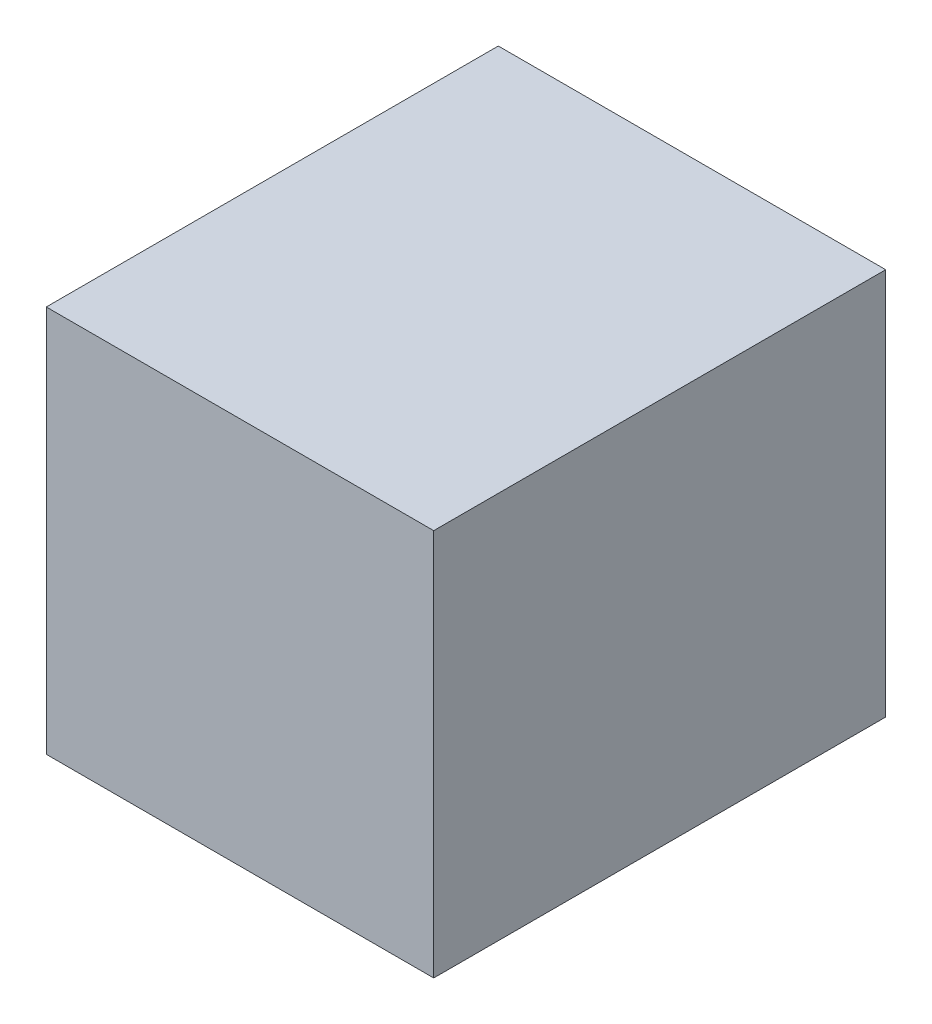
ISO-10303-21;
HEADER;
FILE_DESCRIPTION(('STEP AP214'),'2;1');
FILE_NAME('part.step','',(''),(''),'','','');
FILE_SCHEMA(('AUTOMOTIVE_DESIGN { 1 0 10303 214 1 1 1 1 }'));
ENDSEC;
DATA;
#1=APPLICATION_CONTEXT('core data for automotive mechanical design processes');
#2=APPLICATION_PROTOCOL_DEFINITION('international standard','automotive_design',2000,#1);
#3=PRODUCT_CONTEXT('',#1,'mechanical');
#4=PRODUCT('Part','Part','',(#3));
#5=PRODUCT_RELATED_PRODUCT_CATEGORY('part','',(#4));
#6=PRODUCT_DEFINITION_FORMATION('','',#4);
#7=PRODUCT_DEFINITION_CONTEXT('part definition',#1,'design');
#8=PRODUCT_DEFINITION('design','',#6,#7);
#9=PRODUCT_DEFINITION_SHAPE('','',#8);
#10=(LENGTH_UNIT() NAMED_UNIT(*) SI_UNIT(.MILLI.,.METRE.));
#11=(NAMED_UNIT(*) PLANE_ANGLE_UNIT() SI_UNIT($,.RADIAN.));
#12=(NAMED_UNIT(*) SI_UNIT($,.STERADIAN.) SOLID_ANGLE_UNIT());
#13=UNCERTAINTY_MEASURE_WITH_UNIT(LENGTH_MEASURE(1.E-05),#10,'distance_accuracy_value','');
#14=(GEOMETRIC_REPRESENTATION_CONTEXT(3) GLOBAL_UNCERTAINTY_ASSIGNED_CONTEXT((#13)) GLOBAL_UNIT_ASSIGNED_CONTEXT((#10,
#11,#12)) REPRESENTATION_CONTEXT('',''));
#15=CARTESIAN_POINT('',(0.,0.,0.));
#16=DIRECTION('',(0.,0.,1.));
#17=DIRECTION('',(1.,0.,0.));
#18=AXIS2_PLACEMENT_3D('',#15,#16,#17);
#19=CARTESIAN_POINT('',(30.,-30.,70.));
#20=DIRECTION('',(-1.,0.,0.));
#21=DIRECTION('',(0.,0.,1.));
#22=AXIS2_PLACEMENT_3D('',#19,#20,#21);
#23=PLANE('',#22);
#24=DIRECTION('',(0.,1.,0.));
#25=VECTOR('',#24,1.);
#26=CARTESIAN_POINT('',(30.,-30.,0.));
#27=LINE('',#26,#25);
#28=CARTESIAN_POINT('',(30.,-30.,0.));
#29=VERTEX_POINT('',#28);
#30=CARTESIAN_POINT('',(30.,30.,0.));
#31=VERTEX_POINT('',#30);
#32=EDGE_CURVE('E107',#29,#31,#27,.T.);
#33=ORIENTED_EDGE('',*,*,#32,.T.);
#34=DIRECTION('',(0.,0.,-1.));
#35=VECTOR('',#34,1.);
#36=CARTESIAN_POINT('',(30.,30.,70.));
#37=LINE('',#36,#35);
#38=CARTESIAN_POINT('',(30.,30.,70.));
#39=VERTEX_POINT('',#38);
#40=EDGE_CURVE('E11',#39,#31,#37,.T.);
#41=ORIENTED_EDGE('',*,*,#40,.F.);
#42=DIRECTION('',(0.,1.,0.));
#43=VECTOR('',#42,1.);
#44=CARTESIAN_POINT('',(30.,-30.,70.));
#45=LINE('',#44,#43);
#46=CARTESIAN_POINT('',(30.,-30.,70.));
#47=VERTEX_POINT('',#46);
#48=EDGE_CURVE('E91',#47,#39,#45,.T.);
#49=ORIENTED_EDGE('',*,*,#48,.F.);
#50=DIRECTION('',(0.,0.,-1.));
#51=VECTOR('',#50,1.);
#52=CARTESIAN_POINT('',(30.,-30.,70.));
#53=LINE('',#52,#51);
#54=EDGE_CURVE('E103',#47,#29,#53,.T.);
#55=ORIENTED_EDGE('',*,*,#54,.T.);
#56=EDGE_LOOP('',(#33,#41,#49,#55));
#57=FACE_BOUND('',#56,.T.);
#58=ADVANCED_FACE('F39',(#57),#23,.F.);
#59=CARTESIAN_POINT('',(-30.,30.,70.));
#60=DIRECTION('',(0.,-1.,0.));
#61=DIRECTION('',(0.,0.,-1.));
#62=AXIS2_PLACEMENT_3D('',#59,#60,#61);
#63=PLANE('',#62);
#64=DIRECTION('',(-1.,0.,0.));
#65=VECTOR('',#64,1.);
#66=CARTESIAN_POINT('',(-30.,30.,0.));
#67=LINE('',#66,#65);
#68=CARTESIAN_POINT('',(-30.,30.,0.));
#69=VERTEX_POINT('',#68);
#70=EDGE_CURVE('E96',#31,#69,#67,.T.);
#71=ORIENTED_EDGE('',*,*,#70,.T.);
#72=DIRECTION('',(0.,0.,-1.));
#73=VECTOR('',#72,1.);
#74=CARTESIAN_POINT('',(-30.,30.,70.));
#75=LINE('',#74,#73);
#76=CARTESIAN_POINT('',(-30.,30.,70.));
#77=VERTEX_POINT('',#76);
#78=EDGE_CURVE('E48',#77,#69,#75,.T.);
#79=ORIENTED_EDGE('',*,*,#78,.F.);
#80=DIRECTION('',(-1.,0.,0.));
#81=VECTOR('',#80,1.);
#82=CARTESIAN_POINT('',(-30.,30.,70.));
#83=LINE('',#82,#81);
#84=EDGE_CURVE('E86',#39,#77,#83,.T.);
#85=ORIENTED_EDGE('',*,*,#84,.F.);
#86=ORIENTED_EDGE('',*,*,#40,.T.);
#87=EDGE_LOOP('',(#71,#79,#85,#86));
#88=FACE_BOUND('',#87,.T.);
#89=ADVANCED_FACE('F95',(#88),#63,.F.);
#90=CARTESIAN_POINT('',(-30.,-30.,70.));
#91=DIRECTION('',(1.,0.,0.));
#92=DIRECTION('',(0.,0.,-1.));
#93=AXIS2_PLACEMENT_3D('',#90,#91,#92);
#94=PLANE('',#93);
#95=DIRECTION('',(0.,-1.,0.));
#96=VECTOR('',#95,1.);
#97=CARTESIAN_POINT('',(-30.,-30.,0.));
#98=LINE('',#97,#96);
#99=CARTESIAN_POINT('',(-30.,-30.,0.));
#100=VERTEX_POINT('',#99);
#101=EDGE_CURVE('E73',#69,#100,#98,.T.);
#102=ORIENTED_EDGE('',*,*,#101,.T.);
#103=DIRECTION('',(0.,0.,-1.));
#104=VECTOR('',#103,1.);
#105=CARTESIAN_POINT('',(-30.,-30.,70.));
#106=LINE('',#105,#104);
#107=CARTESIAN_POINT('',(-30.,-30.,70.));
#108=VERTEX_POINT('',#107);
#109=EDGE_CURVE('E98',#108,#100,#106,.T.);
#110=ORIENTED_EDGE('',*,*,#109,.F.);
#111=DIRECTION('',(0.,-1.,0.));
#112=VECTOR('',#111,1.);
#113=CARTESIAN_POINT('',(-30.,-30.,70.));
#114=LINE('',#113,#112);
#115=EDGE_CURVE('E89',#77,#108,#114,.T.);
#116=ORIENTED_EDGE('',*,*,#115,.F.);
#117=ORIENTED_EDGE('',*,*,#78,.T.);
#118=EDGE_LOOP('',(#102,#110,#116,#117));
#119=FACE_BOUND('',#118,.T.);
#120=ADVANCED_FACE('F99',(#119),#94,.F.);
#121=CARTESIAN_POINT('',(-30.,-30.,70.));
#122=DIRECTION('',(0.,1.,0.));
#123=DIRECTION('',(0.,0.,1.));
#124=AXIS2_PLACEMENT_3D('',#121,#122,#123);
#125=PLANE('',#124);
#126=DIRECTION('',(1.,0.,0.));
#127=VECTOR('',#126,1.);
#128=CARTESIAN_POINT('',(-30.,-30.,0.));
#129=LINE('',#128,#127);
#130=EDGE_CURVE('E79',#100,#29,#129,.T.);
#131=ORIENTED_EDGE('',*,*,#130,.T.);
#132=ORIENTED_EDGE('',*,*,#54,.F.);
#133=DIRECTION('',(1.,0.,0.));
#134=VECTOR('',#133,1.);
#135=CARTESIAN_POINT('',(-30.,-30.,70.));
#136=LINE('',#135,#134);
#137=EDGE_CURVE('E56',#108,#47,#136,.T.);
#138=ORIENTED_EDGE('',*,*,#137,.F.);
#139=ORIENTED_EDGE('',*,*,#109,.T.);
#140=EDGE_LOOP('',(#131,#132,#138,#139));
#141=FACE_BOUND('',#140,.T.);
#142=ADVANCED_FACE('F120',(#141),#125,.F.);
#143=CARTESIAN_POINT('',(0.,0.,70.));
#144=DIRECTION('',(0.,0.,-1.));
#145=DIRECTION('',(-1.,0.,0.));
#146=AXIS2_PLACEMENT_3D('',#143,#144,#145);
#147=PLANE('',#146);
#148=ORIENTED_EDGE('',*,*,#48,.T.);
#149=ORIENTED_EDGE('',*,*,#84,.T.);
#150=ORIENTED_EDGE('',*,*,#115,.T.);
#151=ORIENTED_EDGE('',*,*,#137,.T.);
#152=EDGE_LOOP('',(#148,#149,#150,#151));
#153=FACE_BOUND('',#152,.T.);
#154=ADVANCED_FACE('F87',(#153),#147,.F.);
#155=CARTESIAN_POINT('',(0.,0.,0.));
#156=DIRECTION('',(0.,0.,-1.));
#157=DIRECTION('',(-1.,0.,0.));
#158=AXIS2_PLACEMENT_3D('',#155,#156,#157);
#159=PLANE('',#158);
#160=ORIENTED_EDGE('',*,*,#32,.F.);
#161=ORIENTED_EDGE('',*,*,#130,.F.);
#162=ORIENTED_EDGE('',*,*,#101,.F.);
#163=ORIENTED_EDGE('',*,*,#70,.F.);
#164=EDGE_LOOP('',(#160,#161,#162,#163));
#165=FACE_BOUND('',#164,.T.);
#166=ADVANCED_FACE('F123',(#165),#159,.T.);
#167=CLOSED_SHELL('',(#58,#89,#120,#142,#154,#166));
#168=MANIFOLD_SOLID_BREP('B2',#167);
#169=ADVANCED_BREP_SHAPE_REPRESENTATION('',(#18,#168),#14);
#170=SHAPE_DEFINITION_REPRESENTATION(#9,#169);
ENDSEC;
END-ISO-10303-21;
